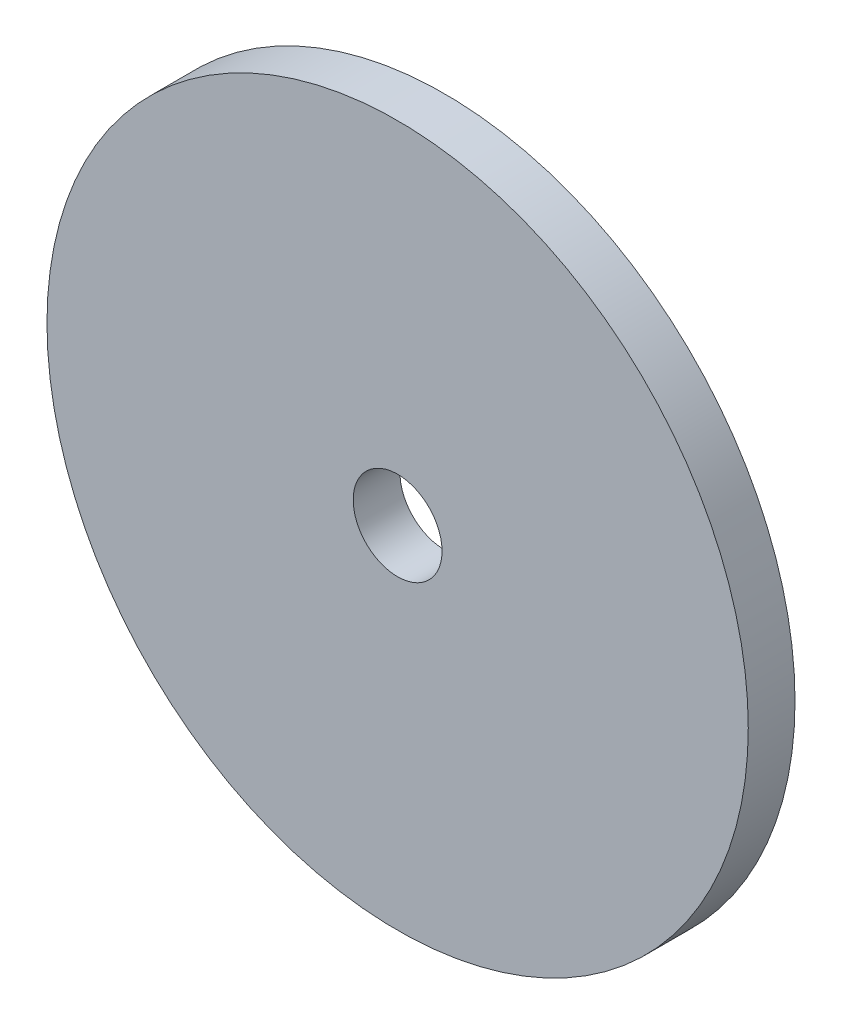
ISO-10303-21;
HEADER;
FILE_DESCRIPTION(('STEP AP214'),'2;1');
FILE_NAME('part.step','',(''),(''),'','','');
FILE_SCHEMA(('AUTOMOTIVE_DESIGN { 1 0 10303 214 1 1 1 1 }'));
ENDSEC;
DATA;
#1=APPLICATION_CONTEXT('core data for automotive mechanical design processes');
#2=APPLICATION_PROTOCOL_DEFINITION('international standard','automotive_design',2000,#1);
#3=PRODUCT_CONTEXT('',#1,'mechanical');
#4=PRODUCT('Part','Part','',(#3));
#5=PRODUCT_RELATED_PRODUCT_CATEGORY('part','',(#4));
#6=PRODUCT_DEFINITION_FORMATION('','',#4);
#7=PRODUCT_DEFINITION_CONTEXT('part definition',#1,'design');
#8=PRODUCT_DEFINITION('design','',#6,#7);
#9=PRODUCT_DEFINITION_SHAPE('','',#8);
#10=(LENGTH_UNIT() NAMED_UNIT(*) SI_UNIT(.MILLI.,.METRE.));
#11=(NAMED_UNIT(*) PLANE_ANGLE_UNIT() SI_UNIT($,.RADIAN.));
#12=(NAMED_UNIT(*) SI_UNIT($,.STERADIAN.) SOLID_ANGLE_UNIT());
#13=UNCERTAINTY_MEASURE_WITH_UNIT(LENGTH_MEASURE(1.E-05),#10,'distance_accuracy_value','');
#14=(GEOMETRIC_REPRESENTATION_CONTEXT(3) GLOBAL_UNCERTAINTY_ASSIGNED_CONTEXT((#13)) GLOBAL_UNIT_ASSIGNED_CONTEXT((#10,
#11,#12)) REPRESENTATION_CONTEXT('',''));
#15=CARTESIAN_POINT('',(0.,0.,0.));
#16=DIRECTION('',(0.,0.,1.));
#17=DIRECTION('',(1.,0.,0.));
#18=AXIS2_PLACEMENT_3D('',#15,#16,#17);
#19=CARTESIAN_POINT('',(-17.4661236603129,-11.0469269225177,10.));
#20=DIRECTION('',(0.,0.,-1.));
#21=DIRECTION('',(-1.,0.,0.));
#22=AXIS2_PLACEMENT_3D('',#19,#20,#21);
#23=CYLINDRICAL_SURFACE('',#22,75.);
#24=CARTESIAN_POINT('',(-17.4661236603129,-11.0469269225177,10.));
#25=DIRECTION('',(0.,0.,1.));
#26=DIRECTION('',(1.,0.,0.));
#27=AXIS2_PLACEMENT_3D('',#24,#25,#26);
#28=CIRCLE('',#27,75.);
#29=CARTESIAN_POINT('',(57.5338763396872,-11.0469269225177,10.));
#30=VERTEX_POINT('',#29);
#31=EDGE_CURVE('E10',#30,#30,#28,.T.);
#32=ORIENTED_EDGE('',*,*,#31,.F.);
#33=EDGE_LOOP('',(#32));
#34=FACE_BOUND('',#33,.T.);
#35=CARTESIAN_POINT('',(-17.4661236603129,-11.0469269225177,0.));
#36=DIRECTION('',(0.,0.,1.));
#37=DIRECTION('',(1.,0.,0.));
#38=AXIS2_PLACEMENT_3D('',#35,#36,#37);
#39=CIRCLE('',#38,75.);
#40=CARTESIAN_POINT('',(57.5338763396872,-11.0469269225177,0.));
#41=VERTEX_POINT('',#40);
#42=EDGE_CURVE('E36',#41,#41,#39,.T.);
#43=ORIENTED_EDGE('',*,*,#42,.T.);
#44=EDGE_LOOP('',(#43));
#45=FACE_BOUND('',#44,.T.);
#46=ADVANCED_FACE('F33',(#34,#45),#23,.T.);
#47=CARTESIAN_POINT('',(-17.4661236603129,-11.0469269225177,10.));
#48=DIRECTION('',(0.,0.,1.));
#49=DIRECTION('',(1.,0.,0.));
#50=AXIS2_PLACEMENT_3D('',#47,#48,#49);
#51=PLANE('',#50);
#52=CARTESIAN_POINT('',(-17.4661236603129,-11.0469269225177,10.));
#53=DIRECTION('',(0.,0.,1.));
#54=DIRECTION('',(1.,0.,0.));
#55=AXIS2_PLACEMENT_3D('',#52,#53,#54);
#56=CIRCLE('',#55,9.5);
#57=CARTESIAN_POINT('',(-7.96612366031286,-11.0469269225177,10.));
#58=VERTEX_POINT('',#57);
#59=EDGE_CURVE('E45',#58,#58,#56,.T.);
#60=ORIENTED_EDGE('',*,*,#59,.F.);
#61=EDGE_LOOP('',(#60));
#62=FACE_BOUND('',#61,.T.);
#63=ORIENTED_EDGE('',*,*,#31,.T.);
#64=EDGE_LOOP('',(#63));
#65=FACE_BOUND('',#64,.T.);
#66=ADVANCED_FACE('F60',(#62,#65),#51,.T.);
#67=CARTESIAN_POINT('',(-17.4661236603129,-11.0469269225177,0.));
#68=DIRECTION('',(0.,0.,1.));
#69=DIRECTION('',(1.,0.,0.));
#70=AXIS2_PLACEMENT_3D('',#67,#68,#69);
#71=PLANE('',#70);
#72=CARTESIAN_POINT('',(-17.4661236603129,-11.0469269225177,0.));
#73=DIRECTION('',(0.,0.,1.));
#74=DIRECTION('',(1.,0.,0.));
#75=AXIS2_PLACEMENT_3D('',#72,#73,#74);
#76=CIRCLE('',#75,9.5);
#77=CARTESIAN_POINT('',(-7.96612366031286,-11.0469269225177,0.));
#78=VERTEX_POINT('',#77);
#79=EDGE_CURVE('E43',#78,#78,#76,.T.);
#80=ORIENTED_EDGE('',*,*,#79,.T.);
#81=EDGE_LOOP('',(#80));
#82=FACE_BOUND('',#81,.T.);
#83=ORIENTED_EDGE('',*,*,#42,.F.);
#84=EDGE_LOOP('',(#83));
#85=FACE_BOUND('',#84,.T.);
#86=ADVANCED_FACE('F51',(#82,#85),#71,.F.);
#87=CARTESIAN_POINT('',(-17.4661236603129,-11.0469269225177,0.));
#88=DIRECTION('',(0.,0.,1.));
#89=DIRECTION('',(1.,0.,0.));
#90=AXIS2_PLACEMENT_3D('',#87,#88,#89);
#91=CYLINDRICAL_SURFACE('',#90,9.5);
#92=ORIENTED_EDGE('',*,*,#79,.F.);
#93=EDGE_LOOP('',(#92));
#94=FACE_BOUND('',#93,.T.);
#95=ORIENTED_EDGE('',*,*,#59,.T.);
#96=EDGE_LOOP('',(#95));
#97=FACE_BOUND('',#96,.T.);
#98=ADVANCED_FACE('F54',(#94,#97),#91,.F.);
#99=CLOSED_SHELL('',(#46,#66,#86,#98));
#100=MANIFOLD_SOLID_BREP('B2',#99);
#101=ADVANCED_BREP_SHAPE_REPRESENTATION('',(#18,#100),#14);
#102=SHAPE_DEFINITION_REPRESENTATION(#9,#101);
ENDSEC;
END-ISO-10303-21;
